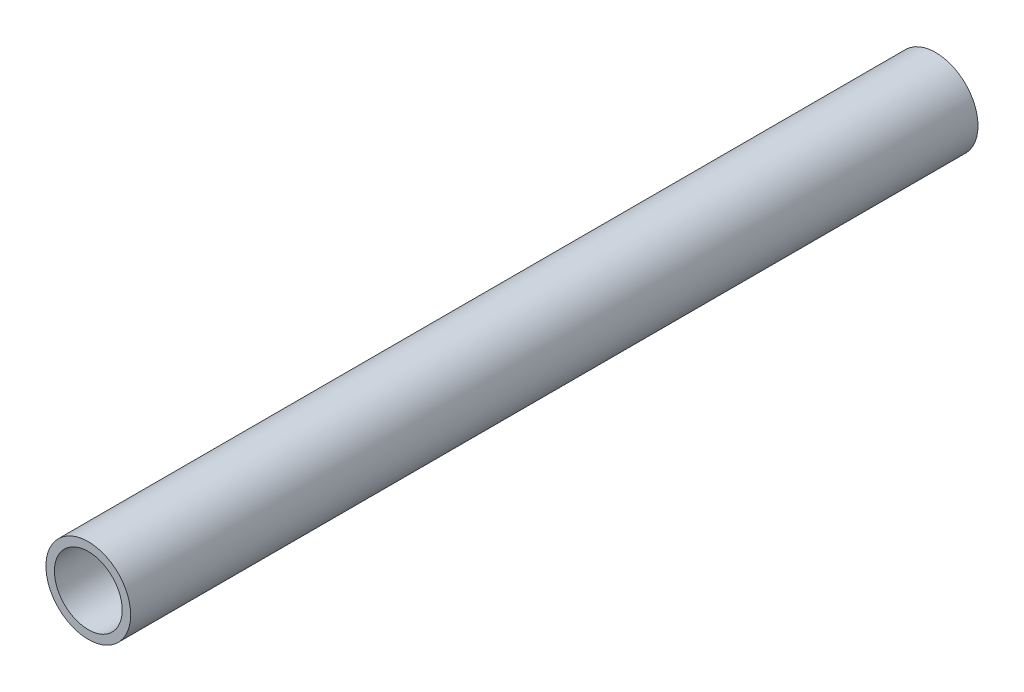
ISO-10303-21;
HEADER;
FILE_DESCRIPTION(('STEP AP214'),'2;1');
FILE_NAME('part.step','',(''),(''),'','','');
FILE_SCHEMA(('AUTOMOTIVE_DESIGN { 1 0 10303 214 1 1 1 1 }'));
ENDSEC;
DATA;
#1=APPLICATION_CONTEXT('core data for automotive mechanical design processes');
#2=APPLICATION_PROTOCOL_DEFINITION('international standard','automotive_design',2000,#1);
#3=PRODUCT_CONTEXT('',#1,'mechanical');
#4=PRODUCT('Part','Part','',(#3));
#5=PRODUCT_RELATED_PRODUCT_CATEGORY('part','',(#4));
#6=PRODUCT_DEFINITION_FORMATION('','',#4);
#7=PRODUCT_DEFINITION_CONTEXT('part definition',#1,'design');
#8=PRODUCT_DEFINITION('design','',#6,#7);
#9=PRODUCT_DEFINITION_SHAPE('','',#8);
#10=(LENGTH_UNIT() NAMED_UNIT(*) SI_UNIT(.MILLI.,.METRE.));
#11=(NAMED_UNIT(*) PLANE_ANGLE_UNIT() SI_UNIT($,.RADIAN.));
#12=(NAMED_UNIT(*) SI_UNIT($,.STERADIAN.) SOLID_ANGLE_UNIT());
#13=UNCERTAINTY_MEASURE_WITH_UNIT(LENGTH_MEASURE(1.E-05),#10,'distance_accuracy_value','');
#14=(GEOMETRIC_REPRESENTATION_CONTEXT(3) GLOBAL_UNCERTAINTY_ASSIGNED_CONTEXT((#13)) GLOBAL_UNIT_ASSIGNED_CONTEXT((#10,
#11,#12)) REPRESENTATION_CONTEXT('',''));
#15=CARTESIAN_POINT('',(0.,0.,0.));
#16=DIRECTION('',(0.,0.,1.));
#17=DIRECTION('',(1.,0.,0.));
#18=AXIS2_PLACEMENT_3D('',#15,#16,#17);
#19=CARTESIAN_POINT('',(0.,0.,300.));
#20=DIRECTION('',(0.,0.,1.));
#21=DIRECTION('',(1.,0.,0.));
#22=AXIS2_PLACEMENT_3D('',#19,#20,#21);
#23=PLANE('',#22);
#24=CARTESIAN_POINT('',(0.,0.,300.));
#25=DIRECTION('',(0.,0.,1.));
#26=DIRECTION('',(1.,0.,0.));
#27=AXIS2_PLACEMENT_3D('',#24,#25,#26);
#28=CIRCLE('',#27,15.);
#29=CARTESIAN_POINT('',(15.,0.,300.));
#30=VERTEX_POINT('',#29);
#31=EDGE_CURVE('E10',#30,#30,#28,.T.);
#32=ORIENTED_EDGE('',*,*,#31,.T.);
#33=EDGE_LOOP('',(#32));
#34=FACE_BOUND('',#33,.T.);
#35=CARTESIAN_POINT('',(0.,0.,300.));
#36=DIRECTION('',(0.,0.,1.));
#37=DIRECTION('',(1.,0.,0.));
#38=AXIS2_PLACEMENT_3D('',#35,#36,#37);
#39=CIRCLE('',#38,12.);
#40=CARTESIAN_POINT('',(12.,0.,300.));
#41=VERTEX_POINT('',#40);
#42=EDGE_CURVE('E50',#41,#41,#39,.T.);
#43=ORIENTED_EDGE('',*,*,#42,.F.);
#44=EDGE_LOOP('',(#43));
#45=FACE_BOUND('',#44,.T.);
#46=ADVANCED_FACE('F37',(#34,#45),#23,.T.);
#47=CARTESIAN_POINT('',(0.,0.,0.));
#48=DIRECTION('',(0.,0.,1.));
#49=DIRECTION('',(1.,0.,0.));
#50=AXIS2_PLACEMENT_3D('',#47,#48,#49);
#51=PLANE('',#50);
#52=CARTESIAN_POINT('',(0.,0.,0.));
#53=DIRECTION('',(0.,0.,1.));
#54=DIRECTION('',(1.,0.,0.));
#55=AXIS2_PLACEMENT_3D('',#52,#53,#54);
#56=CIRCLE('',#55,15.);
#57=CARTESIAN_POINT('',(15.,0.,0.));
#58=VERTEX_POINT('',#57);
#59=EDGE_CURVE('E41',#58,#58,#56,.T.);
#60=ORIENTED_EDGE('',*,*,#59,.F.);
#61=EDGE_LOOP('',(#60));
#62=FACE_BOUND('',#61,.T.);
#63=CARTESIAN_POINT('',(0.,0.,0.));
#64=DIRECTION('',(0.,0.,1.));
#65=DIRECTION('',(1.,0.,0.));
#66=AXIS2_PLACEMENT_3D('',#63,#64,#65);
#67=CIRCLE('',#66,12.);
#68=CARTESIAN_POINT('',(12.,0.,0.));
#69=VERTEX_POINT('',#68);
#70=EDGE_CURVE('E52',#69,#69,#67,.T.);
#71=ORIENTED_EDGE('',*,*,#70,.T.);
#72=EDGE_LOOP('',(#71));
#73=FACE_BOUND('',#72,.T.);
#74=ADVANCED_FACE('F64',(#62,#73),#51,.F.);
#75=CARTESIAN_POINT('',(0.,0.,300.));
#76=DIRECTION('',(0.,0.,-1.));
#77=DIRECTION('',(-1.,0.,0.));
#78=AXIS2_PLACEMENT_3D('',#75,#76,#77);
#79=CYLINDRICAL_SURFACE('',#78,15.);
#80=ORIENTED_EDGE('',*,*,#31,.F.);
#81=EDGE_LOOP('',(#80));
#82=FACE_BOUND('',#81,.T.);
#83=ORIENTED_EDGE('',*,*,#59,.T.);
#84=EDGE_LOOP('',(#83));
#85=FACE_BOUND('',#84,.T.);
#86=ADVANCED_FACE('F39',(#82,#85),#79,.T.);
#87=CARTESIAN_POINT('',(0.,0.,300.));
#88=DIRECTION('',(0.,0.,-1.));
#89=DIRECTION('',(-1.,0.,0.));
#90=AXIS2_PLACEMENT_3D('',#87,#88,#89);
#91=CYLINDRICAL_SURFACE('',#90,12.);
#92=ORIENTED_EDGE('',*,*,#42,.T.);
#93=EDGE_LOOP('',(#92));
#94=FACE_BOUND('',#93,.T.);
#95=ORIENTED_EDGE('',*,*,#70,.F.);
#96=EDGE_LOOP('',(#95));
#97=FACE_BOUND('',#96,.T.);
#98=ADVANCED_FACE('F60',(#94,#97),#91,.F.);
#99=CLOSED_SHELL('',(#46,#74,#86,#98));
#100=MANIFOLD_SOLID_BREP('B2',#99);
#101=ADVANCED_BREP_SHAPE_REPRESENTATION('',(#18,#100),#14);
#102=SHAPE_DEFINITION_REPRESENTATION(#9,#101);
ENDSEC;
END-ISO-10303-21;
